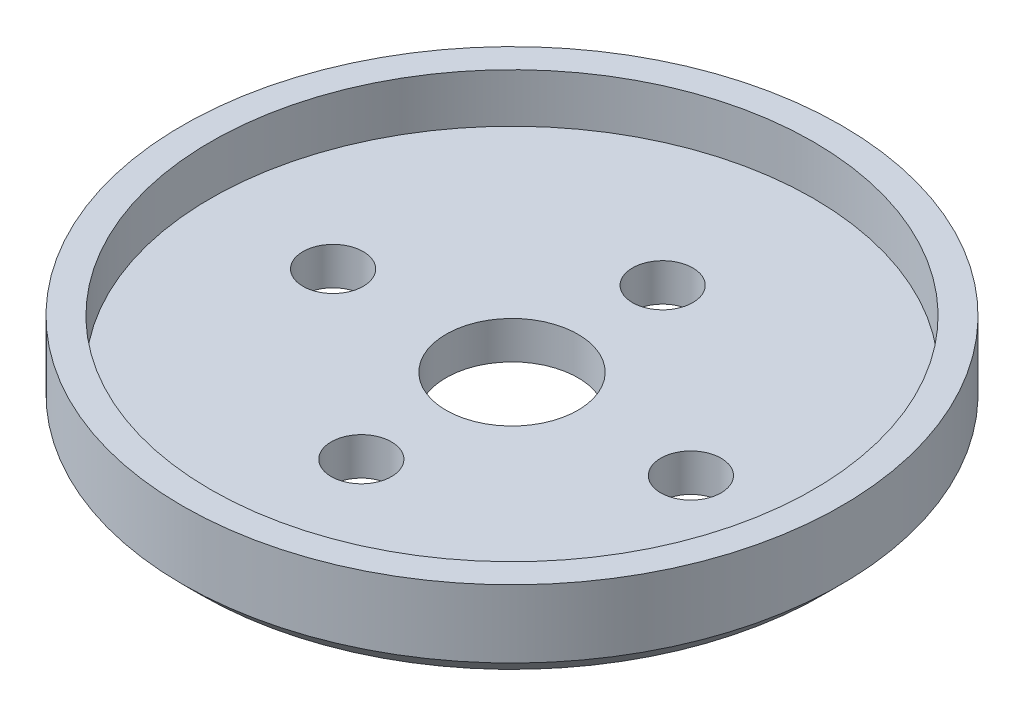
ISO-10303-21;
HEADER;
FILE_DESCRIPTION(('STEP AP214'),'2;1');
FILE_NAME('part.step','',(''),(''),'','','');
FILE_SCHEMA(('AUTOMOTIVE_DESIGN { 1 0 10303 214 1 1 1 1 }'));
ENDSEC;
DATA;
#1=APPLICATION_CONTEXT('core data for automotive mechanical design processes');
#2=APPLICATION_PROTOCOL_DEFINITION('international standard','automotive_design',2000,#1);
#3=PRODUCT_CONTEXT('',#1,'mechanical');
#4=PRODUCT('Part','Part','',(#3));
#5=PRODUCT_RELATED_PRODUCT_CATEGORY('part','',(#4));
#6=PRODUCT_DEFINITION_FORMATION('','',#4);
#7=PRODUCT_DEFINITION_CONTEXT('part definition',#1,'design');
#8=PRODUCT_DEFINITION('design','',#6,#7);
#9=PRODUCT_DEFINITION_SHAPE('','',#8);
#10=(LENGTH_UNIT() NAMED_UNIT(*) SI_UNIT(.MILLI.,.METRE.));
#11=(NAMED_UNIT(*) PLANE_ANGLE_UNIT() SI_UNIT($,.RADIAN.));
#12=(NAMED_UNIT(*) SI_UNIT($,.STERADIAN.) SOLID_ANGLE_UNIT());
#13=UNCERTAINTY_MEASURE_WITH_UNIT(LENGTH_MEASURE(1.E-05),#10,'distance_accuracy_value','');
#14=(GEOMETRIC_REPRESENTATION_CONTEXT(3) GLOBAL_UNCERTAINTY_ASSIGNED_CONTEXT((#13)) GLOBAL_UNIT_ASSIGNED_CONTEXT((#10,
#11,#12)) REPRESENTATION_CONTEXT('',''));
#15=CARTESIAN_POINT('',(0.,0.,0.));
#16=DIRECTION('',(0.,0.,1.));
#17=DIRECTION('',(1.,0.,0.));
#18=AXIS2_PLACEMENT_3D('',#15,#16,#17);
#19=CARTESIAN_POINT('',(0.,2.,0.));
#20=DIRECTION('',(0.,1.,0.));
#21=DIRECTION('',(0.,0.,1.));
#22=AXIS2_PLACEMENT_3D('',#19,#20,#21);
#23=PLANE('',#22);
#24=CARTESIAN_POINT('',(-9.5,2.,0.));
#25=DIRECTION('',(0.,1.,0.));
#26=DIRECTION('',(0.,0.,1.));
#27=AXIS2_PLACEMENT_3D('',#24,#25,#26);
#28=CIRCLE('',#27,1.6);
#29=CARTESIAN_POINT('',(-9.5,2.,1.6));
#30=VERTEX_POINT('',#29);
#31=EDGE_CURVE('E74',#30,#30,#28,.T.);
#32=ORIENTED_EDGE('',*,*,#31,.F.);
#33=EDGE_LOOP('',(#32));
#34=FACE_BOUND('',#33,.T.);
#35=CARTESIAN_POINT('',(0.,2.,8.));
#36=DIRECTION('',(0.,1.,0.));
#37=DIRECTION('',(0.,0.,1.));
#38=AXIS2_PLACEMENT_3D('',#35,#36,#37);
#39=CIRCLE('',#38,1.6);
#40=CARTESIAN_POINT('',(0.,2.,9.6));
#41=VERTEX_POINT('',#40);
#42=EDGE_CURVE('E92',#41,#41,#39,.T.);
#43=ORIENTED_EDGE('',*,*,#42,.F.);
#44=EDGE_LOOP('',(#43));
#45=FACE_BOUND('',#44,.T.);
#46=CARTESIAN_POINT('',(0.,2.,-8.));
#47=DIRECTION('',(0.,1.,0.));
#48=DIRECTION('',(0.,0.,1.));
#49=AXIS2_PLACEMENT_3D('',#46,#47,#48);
#50=CIRCLE('',#49,1.6);
#51=CARTESIAN_POINT('',(0.,2.,-6.4));
#52=VERTEX_POINT('',#51);
#53=EDGE_CURVE('E89',#52,#52,#50,.T.);
#54=ORIENTED_EDGE('',*,*,#53,.F.);
#55=EDGE_LOOP('',(#54));
#56=FACE_BOUND('',#55,.T.);
#57=CARTESIAN_POINT('',(9.5,2.,0.));
#58=DIRECTION('',(0.,1.,0.));
#59=DIRECTION('',(0.,0.,1.));
#60=AXIS2_PLACEMENT_3D('',#57,#58,#59);
#61=CIRCLE('',#60,1.6);
#62=CARTESIAN_POINT('',(9.5,2.,1.6));
#63=VERTEX_POINT('',#62);
#64=EDGE_CURVE('E86',#63,#63,#61,.T.);
#65=ORIENTED_EDGE('',*,*,#64,.F.);
#66=EDGE_LOOP('',(#65));
#67=FACE_BOUND('',#66,.T.);
#68=CARTESIAN_POINT('',(0.,2.,0.));
#69=DIRECTION('',(0.,1.,0.));
#70=DIRECTION('',(0.,0.,1.));
#71=AXIS2_PLACEMENT_3D('',#68,#69,#70);
#72=CIRCLE('',#71,3.5);
#73=CARTESIAN_POINT('',(0.,2.,3.5));
#74=VERTEX_POINT('',#73);
#75=EDGE_CURVE('E59',#74,#74,#72,.T.);
#76=ORIENTED_EDGE('',*,*,#75,.F.);
#77=EDGE_LOOP('',(#76));
#78=FACE_BOUND('',#77,.T.);
#79=CARTESIAN_POINT('',(0.,2.,0.));
#80=DIRECTION('',(0.,1.,0.));
#81=DIRECTION('',(0.,0.,1.));
#82=AXIS2_PLACEMENT_3D('',#79,#80,#81);
#83=CIRCLE('',#82,16.);
#84=CARTESIAN_POINT('',(0.,2.,16.));
#85=VERTEX_POINT('',#84);
#86=EDGE_CURVE('E55',#85,#85,#83,.F.);
#87=ORIENTED_EDGE('',*,*,#86,.F.);
#88=EDGE_LOOP('',(#87));
#89=FACE_BOUND('',#88,.T.);
#90=ADVANCED_FACE('F43',(#34,#45,#56,#67,#78,#89),#23,.T.);
#91=CARTESIAN_POINT('',(0.,0.,0.));
#92=DIRECTION('',(0.,1.,0.));
#93=DIRECTION('',(0.,0.,1.));
#94=AXIS2_PLACEMENT_3D('',#91,#92,#93);
#95=PLANE('',#94);
#96=CARTESIAN_POINT('',(0.,0.,0.));
#97=DIRECTION('',(0.,1.,0.));
#98=DIRECTION('',(0.,0.,1.));
#99=AXIS2_PLACEMENT_3D('',#96,#97,#98);
#100=CIRCLE('',#99,16.5);
#101=CARTESIAN_POINT('',(0.,0.,16.5));
#102=VERTEX_POINT('',#101);
#103=EDGE_CURVE('E11',#102,#102,#100,.F.);
#104=ORIENTED_EDGE('',*,*,#103,.T.);
#105=EDGE_LOOP('',(#104));
#106=FACE_BOUND('',#105,.T.);
#107=CARTESIAN_POINT('',(-9.5,0.,0.));
#108=DIRECTION('',(0.,1.,0.));
#109=DIRECTION('',(0.,0.,1.));
#110=AXIS2_PLACEMENT_3D('',#107,#108,#109);
#111=CIRCLE('',#110,1.6);
#112=CARTESIAN_POINT('',(-9.5,0.,1.6));
#113=VERTEX_POINT('',#112);
#114=EDGE_CURVE('E62',#113,#113,#111,.T.);
#115=ORIENTED_EDGE('',*,*,#114,.T.);
#116=EDGE_LOOP('',(#115));
#117=FACE_BOUND('',#116,.T.);
#118=CARTESIAN_POINT('',(0.,0.,8.));
#119=DIRECTION('',(0.,1.,0.));
#120=DIRECTION('',(0.,0.,1.));
#121=AXIS2_PLACEMENT_3D('',#118,#119,#120);
#122=CIRCLE('',#121,1.6);
#123=CARTESIAN_POINT('',(0.,0.,9.6));
#124=VERTEX_POINT('',#123);
#125=EDGE_CURVE('E66',#124,#124,#122,.T.);
#126=ORIENTED_EDGE('',*,*,#125,.T.);
#127=EDGE_LOOP('',(#126));
#128=FACE_BOUND('',#127,.T.);
#129=CARTESIAN_POINT('',(0.,0.,-8.));
#130=DIRECTION('',(0.,1.,0.));
#131=DIRECTION('',(0.,0.,1.));
#132=AXIS2_PLACEMENT_3D('',#129,#130,#131);
#133=CIRCLE('',#132,1.6);
#134=CARTESIAN_POINT('',(0.,0.,-6.4));
#135=VERTEX_POINT('',#134);
#136=EDGE_CURVE('E69',#135,#135,#133,.T.);
#137=ORIENTED_EDGE('',*,*,#136,.T.);
#138=EDGE_LOOP('',(#137));
#139=FACE_BOUND('',#138,.T.);
#140=CARTESIAN_POINT('',(9.5,0.,0.));
#141=DIRECTION('',(0.,1.,0.));
#142=DIRECTION('',(0.,0.,1.));
#143=AXIS2_PLACEMENT_3D('',#140,#141,#142);
#144=CIRCLE('',#143,1.6);
#145=CARTESIAN_POINT('',(9.5,0.,1.6));
#146=VERTEX_POINT('',#145);
#147=EDGE_CURVE('E72',#146,#146,#144,.T.);
#148=ORIENTED_EDGE('',*,*,#147,.T.);
#149=EDGE_LOOP('',(#148));
#150=FACE_BOUND('',#149,.T.);
#151=CARTESIAN_POINT('',(0.,0.,0.));
#152=DIRECTION('',(0.,1.,0.));
#153=DIRECTION('',(0.,0.,1.));
#154=AXIS2_PLACEMENT_3D('',#151,#152,#153);
#155=CIRCLE('',#154,3.5);
#156=CARTESIAN_POINT('',(0.,0.,3.5));
#157=VERTEX_POINT('',#156);
#158=EDGE_CURVE('E76',#157,#157,#155,.T.);
#159=ORIENTED_EDGE('',*,*,#158,.T.);
#160=EDGE_LOOP('',(#159));
#161=FACE_BOUND('',#160,.T.);
#162=ADVANCED_FACE('F103',(#106,#117,#128,#139,#150,#161),#95,.F.);
#163=CARTESIAN_POINT('',(0.,2.,0.));
#164=DIRECTION('',(0.,-1.,0.));
#165=DIRECTION('',(0.,0.,-1.));
#166=AXIS2_PLACEMENT_3D('',#163,#164,#165);
#167=CYLINDRICAL_SURFACE('',#166,17.5);
#168=CARTESIAN_POINT('',(0.,1.,0.));
#169=DIRECTION('',(0.,1.,0.));
#170=DIRECTION('',(0.,0.,1.));
#171=AXIS2_PLACEMENT_3D('',#168,#169,#170);
#172=CIRCLE('',#171,17.5);
#173=CARTESIAN_POINT('',(0.,1.,17.5));
#174=VERTEX_POINT('',#173);
#175=EDGE_CURVE('E51',#174,#174,#172,.T.);
#176=ORIENTED_EDGE('',*,*,#175,.T.);
#177=EDGE_LOOP('',(#176));
#178=FACE_BOUND('',#177,.T.);
#179=CARTESIAN_POINT('',(0.,4.6,0.));
#180=DIRECTION('',(0.,1.,0.));
#181=DIRECTION('',(0.,0.,1.));
#182=AXIS2_PLACEMENT_3D('',#179,#180,#181);
#183=CIRCLE('',#182,17.5);
#184=CARTESIAN_POINT('',(0.,4.6,17.5));
#185=VERTEX_POINT('',#184);
#186=EDGE_CURVE('E79',#185,#185,#183,.T.);
#187=ORIENTED_EDGE('',*,*,#186,.F.);
#188=EDGE_LOOP('',(#187));
#189=FACE_BOUND('',#188,.T.);
#190=ADVANCED_FACE('F129',(#178,#189),#167,.T.);
#191=CARTESIAN_POINT('',(0.,2.,0.));
#192=DIRECTION('',(0.,-1.,0.));
#193=DIRECTION('',(0.,0.,-1.));
#194=AXIS2_PLACEMENT_3D('',#191,#192,#193);
#195=CYLINDRICAL_SURFACE('',#194,3.5);
#196=ORIENTED_EDGE('',*,*,#75,.T.);
#197=EDGE_LOOP('',(#196));
#198=FACE_BOUND('',#197,.T.);
#199=ORIENTED_EDGE('',*,*,#158,.F.);
#200=EDGE_LOOP('',(#199));
#201=FACE_BOUND('',#200,.T.);
#202=ADVANCED_FACE('F119',(#198,#201),#195,.F.);
#203=CARTESIAN_POINT('',(0.,58.6974746830583,0.));
#204=DIRECTION('',(0.,-1.,0.));
#205=DIRECTION('',(0.,0.,-1.));
#206=AXIS2_PLACEMENT_3D('',#203,#204,#205);
#207=CYLINDRICAL_SURFACE('',#206,16.);
#208=ORIENTED_EDGE('',*,*,#86,.T.);
#209=EDGE_LOOP('',(#208));
#210=FACE_BOUND('',#209,.T.);
#211=CARTESIAN_POINT('',(0.,4.6,0.));
#212=DIRECTION('',(0.,1.,0.));
#213=DIRECTION('',(0.,0.,1.));
#214=AXIS2_PLACEMENT_3D('',#211,#212,#213);
#215=CIRCLE('',#214,16.);
#216=CARTESIAN_POINT('',(0.,4.6,16.));
#217=VERTEX_POINT('',#216);
#218=EDGE_CURVE('E65',#217,#217,#215,.T.);
#219=ORIENTED_EDGE('',*,*,#218,.T.);
#220=EDGE_LOOP('',(#219));
#221=FACE_BOUND('',#220,.T.);
#222=ADVANCED_FACE('F115',(#210,#221),#207,.F.);
#223=CARTESIAN_POINT('',(0.,4.6,0.));
#224=DIRECTION('',(0.,1.,0.));
#225=DIRECTION('',(0.,0.,1.));
#226=AXIS2_PLACEMENT_3D('',#223,#224,#225);
#227=PLANE('',#226);
#228=ORIENTED_EDGE('',*,*,#218,.F.);
#229=EDGE_LOOP('',(#228));
#230=FACE_BOUND('',#229,.T.);
#231=ORIENTED_EDGE('',*,*,#186,.T.);
#232=EDGE_LOOP('',(#231));
#233=FACE_BOUND('',#232,.T.);
#234=ADVANCED_FACE('F118',(#230,#233),#227,.T.);
#235=CARTESIAN_POINT('',(9.5,-1.,0.));
#236=DIRECTION('',(0.,1.,0.));
#237=DIRECTION('',(0.,0.,1.));
#238=AXIS2_PLACEMENT_3D('',#235,#236,#237);
#239=CYLINDRICAL_SURFACE('',#238,1.6);
#240=ORIENTED_EDGE('',*,*,#64,.T.);
#241=EDGE_LOOP('',(#240));
#242=FACE_BOUND('',#241,.T.);
#243=ORIENTED_EDGE('',*,*,#147,.F.);
#244=EDGE_LOOP('',(#243));
#245=FACE_BOUND('',#244,.T.);
#246=ADVANCED_FACE('F125',(#242,#245),#239,.F.);
#247=CARTESIAN_POINT('',(0.,-1.,-8.));
#248=DIRECTION('',(0.,1.,0.));
#249=DIRECTION('',(0.,0.,1.));
#250=AXIS2_PLACEMENT_3D('',#247,#248,#249);
#251=CYLINDRICAL_SURFACE('',#250,1.6);
#252=ORIENTED_EDGE('',*,*,#53,.T.);
#253=EDGE_LOOP('',(#252));
#254=FACE_BOUND('',#253,.T.);
#255=ORIENTED_EDGE('',*,*,#136,.F.);
#256=EDGE_LOOP('',(#255));
#257=FACE_BOUND('',#256,.T.);
#258=ADVANCED_FACE('F142',(#254,#257),#251,.F.);
#259=CARTESIAN_POINT('',(0.,-1.,8.));
#260=DIRECTION('',(0.,1.,0.));
#261=DIRECTION('',(0.,0.,1.));
#262=AXIS2_PLACEMENT_3D('',#259,#260,#261);
#263=CYLINDRICAL_SURFACE('',#262,1.6);
#264=ORIENTED_EDGE('',*,*,#42,.T.);
#265=EDGE_LOOP('',(#264));
#266=FACE_BOUND('',#265,.T.);
#267=ORIENTED_EDGE('',*,*,#125,.F.);
#268=EDGE_LOOP('',(#267));
#269=FACE_BOUND('',#268,.T.);
#270=ADVANCED_FACE('F146',(#266,#269),#263,.F.);
#271=CARTESIAN_POINT('',(-9.5,-1.,0.));
#272=DIRECTION('',(0.,1.,0.));
#273=DIRECTION('',(0.,0.,1.));
#274=AXIS2_PLACEMENT_3D('',#271,#272,#273);
#275=CYLINDRICAL_SURFACE('',#274,1.6);
#276=ORIENTED_EDGE('',*,*,#31,.T.);
#277=EDGE_LOOP('',(#276));
#278=FACE_BOUND('',#277,.T.);
#279=ORIENTED_EDGE('',*,*,#114,.F.);
#280=EDGE_LOOP('',(#279));
#281=FACE_BOUND('',#280,.T.);
#282=ADVANCED_FACE('F98',(#278,#281),#275,.F.);
#283=CARTESIAN_POINT('',(0.,1.,0.));
#284=DIRECTION('',(0.,1.,0.));
#285=DIRECTION('',(0.,0.,1.));
#286=AXIS2_PLACEMENT_3D('',#283,#284,#285);
#287=CONICAL_SURFACE('',#286,17.5,0.78539816339745);
#288=ORIENTED_EDGE('',*,*,#103,.F.);
#289=EDGE_LOOP('',(#288));
#290=FACE_BOUND('',#289,.T.);
#291=ORIENTED_EDGE('',*,*,#175,.F.);
#292=EDGE_LOOP('',(#291));
#293=FACE_BOUND('',#292,.T.);
#294=ADVANCED_FACE('F46',(#290,#293),#287,.T.);
#295=CLOSED_SHELL('',(#90,#162,#190,#202,#222,#234,#246,#258,#270,#282,#294));
#296=MANIFOLD_SOLID_BREP('B2',#295);
#297=ADVANCED_BREP_SHAPE_REPRESENTATION('',(#18,#296),#14);
#298=SHAPE_DEFINITION_REPRESENTATION(#9,#297);
ENDSEC;
END-ISO-10303-21;
